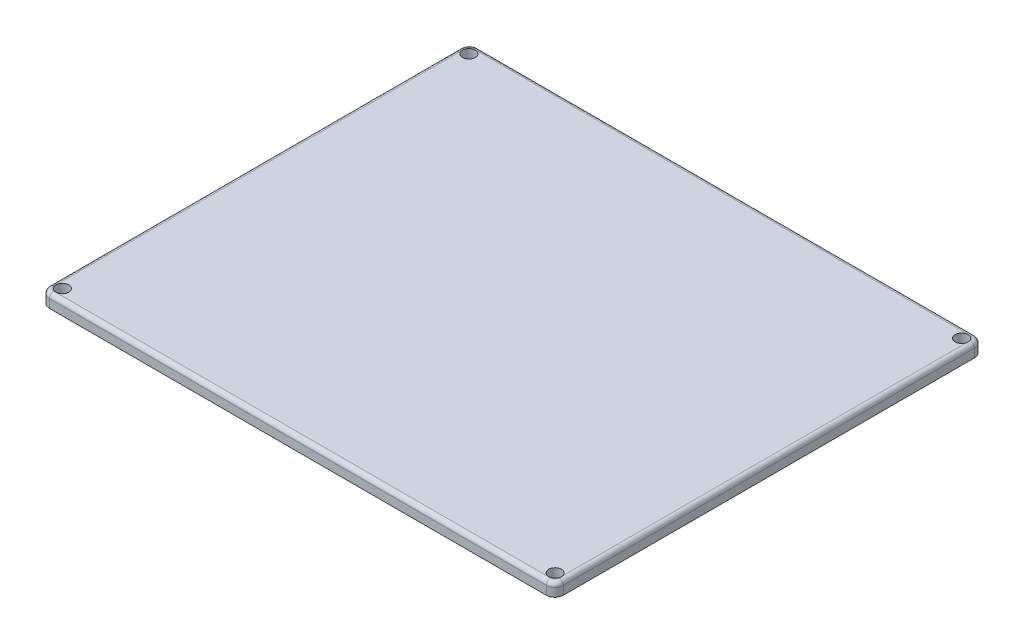
ISO-10303-21;
HEADER;
FILE_DESCRIPTION(('STEP AP214'),'2;1');
FILE_NAME('part.step','',(''),(''),'','','');
FILE_SCHEMA(('AUTOMOTIVE_DESIGN { 1 0 10303 214 1 1 1 1 }'));
ENDSEC;
DATA;
#1=APPLICATION_CONTEXT('core data for automotive mechanical design processes');
#2=APPLICATION_PROTOCOL_DEFINITION('international standard','automotive_design',2000,#1);
#3=PRODUCT_CONTEXT('',#1,'mechanical');
#4=PRODUCT('Part','Part','',(#3));
#5=PRODUCT_RELATED_PRODUCT_CATEGORY('part','',(#4));
#6=PRODUCT_DEFINITION_FORMATION('','',#4);
#7=PRODUCT_DEFINITION_CONTEXT('part definition',#1,'design');
#8=PRODUCT_DEFINITION('design','',#6,#7);
#9=PRODUCT_DEFINITION_SHAPE('','',#8);
#10=(LENGTH_UNIT() NAMED_UNIT(*) SI_UNIT(.MILLI.,.METRE.));
#11=(NAMED_UNIT(*) PLANE_ANGLE_UNIT() SI_UNIT($,.RADIAN.));
#12=(NAMED_UNIT(*) SI_UNIT($,.STERADIAN.) SOLID_ANGLE_UNIT());
#13=UNCERTAINTY_MEASURE_WITH_UNIT(LENGTH_MEASURE(1.E-05),#10,'distance_accuracy_value','');
#14=(GEOMETRIC_REPRESENTATION_CONTEXT(3) GLOBAL_UNCERTAINTY_ASSIGNED_CONTEXT((#13)) GLOBAL_UNIT_ASSIGNED_CONTEXT((#10,
#11,#12)) REPRESENTATION_CONTEXT('',''));
#15=CARTESIAN_POINT('',(0.,0.,0.));
#16=DIRECTION('',(0.,0.,1.));
#17=DIRECTION('',(1.,0.,0.));
#18=AXIS2_PLACEMENT_3D('',#15,#16,#17);
#19=CARTESIAN_POINT('',(0.,3.,0.));
#20=DIRECTION('',(0.,1.,0.));
#21=DIRECTION('',(0.,0.,1.));
#22=AXIS2_PLACEMENT_3D('',#19,#20,#21);
#23=PLANE('',#22);
#24=CARTESIAN_POINT('',(58.,3.,-48.));
#25=DIRECTION('',(0.,1.,0.));
#26=DIRECTION('',(0.,0.,1.));
#27=AXIS2_PLACEMENT_3D('',#24,#25,#26);
#28=CIRCLE('',#27,1.);
#29=CARTESIAN_POINT('',(58.,3.,-49.));
#30=VERTEX_POINT('',#29);
#31=CARTESIAN_POINT('',(59.,3.,-48.));
#32=VERTEX_POINT('',#31);
#33=EDGE_CURVE('E344',#30,#32,#28,.F.);
#34=ORIENTED_EDGE('',*,*,#33,.F.);
#35=DIRECTION('',(-1.,0.,0.));
#36=VECTOR('',#35,1.);
#37=CARTESIAN_POINT('',(-60.,3.,-49.));
#38=LINE('',#37,#36);
#39=CARTESIAN_POINT('',(-58.,3.,-49.));
#40=VERTEX_POINT('',#39);
#41=EDGE_CURVE('E411',#30,#40,#38,.T.);
#42=ORIENTED_EDGE('',*,*,#41,.T.);
#43=CARTESIAN_POINT('',(-58.,3.,-48.));
#44=DIRECTION('',(0.,1.,0.));
#45=DIRECTION('',(0.,0.,1.));
#46=AXIS2_PLACEMENT_3D('',#43,#44,#45);
#47=CIRCLE('',#46,1.);
#48=CARTESIAN_POINT('',(-59.,3.,-48.));
#49=VERTEX_POINT('',#48);
#50=EDGE_CURVE('E332',#49,#40,#47,.F.);
#51=ORIENTED_EDGE('',*,*,#50,.F.);
#52=DIRECTION('',(0.,0.,1.));
#53=VECTOR('',#52,1.);
#54=CARTESIAN_POINT('',(-59.,3.,50.));
#55=LINE('',#54,#53);
#56=CARTESIAN_POINT('',(-59.,3.,-47.7587144016012));
#57=VERTEX_POINT('',#56);
#58=EDGE_CURVE('E183',#49,#57,#55,.T.);
#59=ORIENTED_EDGE('',*,*,#58,.T.);
#60=CARTESIAN_POINT('',(-57.5290232809627,3.,-47.4650692210682));
#61=DIRECTION('',(0.,-1.,0.));
#62=DIRECTION('',(0.,0.,1.));
#63=AXIS2_PLACEMENT_3D('',#60,#61,#62);
#64=CIRCLE('',#63,1.5);
#65=CARTESIAN_POINT('',(-59.,3.,-47.1714240405352));
#66=VERTEX_POINT('',#65);
#67=EDGE_CURVE('E456',#57,#66,#64,.T.);
#68=ORIENTED_EDGE('',*,*,#67,.T.);
#69=DIRECTION('',(0.,0.,1.));
#70=VECTOR('',#69,1.);
#71=CARTESIAN_POINT('',(-59.,3.,50.));
#72=LINE('',#71,#70);
#73=CARTESIAN_POINT('',(-59.,3.,47.1714240405351));
#74=VERTEX_POINT('',#73);
#75=EDGE_CURVE('E200',#66,#74,#72,.T.);
#76=ORIENTED_EDGE('',*,*,#75,.T.);
#77=CARTESIAN_POINT('',(-57.5290232809627,3.,47.4650692210682));
#78=DIRECTION('',(0.,-1.,0.));
#79=DIRECTION('',(0.,0.,-1.));
#80=AXIS2_PLACEMENT_3D('',#77,#78,#79);
#81=CIRCLE('',#80,1.5);
#82=CARTESIAN_POINT('',(-59.,3.,47.7587144016013));
#83=VERTEX_POINT('',#82);
#84=EDGE_CURVE('E447',#74,#83,#81,.T.);
#85=ORIENTED_EDGE('',*,*,#84,.T.);
#86=DIRECTION('',(0.,0.,1.));
#87=VECTOR('',#86,1.);
#88=CARTESIAN_POINT('',(-59.,3.,50.));
#89=LINE('',#88,#87);
#90=CARTESIAN_POINT('',(-59.,3.,48.));
#91=VERTEX_POINT('',#90);
#92=EDGE_CURVE('E196',#83,#91,#89,.T.);
#93=ORIENTED_EDGE('',*,*,#92,.T.);
#94=CARTESIAN_POINT('',(-58.,3.,48.));
#95=DIRECTION('',(0.,1.,0.));
#96=DIRECTION('',(0.,0.,1.));
#97=AXIS2_PLACEMENT_3D('',#94,#95,#96);
#98=CIRCLE('',#97,1.);
#99=CARTESIAN_POINT('',(-58.,3.,49.));
#100=VERTEX_POINT('',#99);
#101=EDGE_CURVE('E426',#100,#91,#98,.F.);
#102=ORIENTED_EDGE('',*,*,#101,.F.);
#103=DIRECTION('',(1.,0.,0.));
#104=VECTOR('',#103,1.);
#105=CARTESIAN_POINT('',(60.,3.,49.));
#106=LINE('',#105,#104);
#107=CARTESIAN_POINT('',(58.,3.,49.));
#108=VERTEX_POINT('',#107);
#109=EDGE_CURVE('E187',#100,#108,#106,.T.);
#110=ORIENTED_EDGE('',*,*,#109,.T.);
#111=CARTESIAN_POINT('',(58.,3.,48.));
#112=DIRECTION('',(0.,1.,0.));
#113=DIRECTION('',(0.,0.,1.));
#114=AXIS2_PLACEMENT_3D('',#111,#112,#113);
#115=CIRCLE('',#114,1.);
#116=CARTESIAN_POINT('',(59.,3.,48.));
#117=VERTEX_POINT('',#116);
#118=EDGE_CURVE('E431',#117,#108,#115,.F.);
#119=ORIENTED_EDGE('',*,*,#118,.F.);
#120=DIRECTION('',(0.,0.,-1.));
#121=VECTOR('',#120,1.);
#122=CARTESIAN_POINT('',(59.,3.,-50.));
#123=LINE('',#122,#121);
#124=CARTESIAN_POINT('',(59.,3.,47.7587144016013));
#125=VERTEX_POINT('',#124);
#126=EDGE_CURVE('E173',#117,#125,#123,.T.);
#127=ORIENTED_EDGE('',*,*,#126,.T.);
#128=CARTESIAN_POINT('',(57.5290232809627,3.,47.4650692210682));
#129=DIRECTION('',(0.,-1.,0.));
#130=DIRECTION('',(0.,0.,1.));
#131=AXIS2_PLACEMENT_3D('',#128,#129,#130);
#132=CIRCLE('',#131,1.5);
#133=CARTESIAN_POINT('',(59.,3.,47.171424040535));
#134=VERTEX_POINT('',#133);
#135=EDGE_CURVE('E160',#125,#134,#132,.T.);
#136=ORIENTED_EDGE('',*,*,#135,.T.);
#137=DIRECTION('',(0.,0.,-1.));
#138=VECTOR('',#137,1.);
#139=CARTESIAN_POINT('',(59.,3.,-50.));
#140=LINE('',#139,#138);
#141=CARTESIAN_POINT('',(59.,3.,-47.1714240405352));
#142=VERTEX_POINT('',#141);
#143=EDGE_CURVE('E170',#134,#142,#140,.T.);
#144=ORIENTED_EDGE('',*,*,#143,.T.);
#145=CARTESIAN_POINT('',(57.5290232809627,3.,-47.4650692210682));
#146=DIRECTION('',(0.,-1.,0.));
#147=DIRECTION('',(0.,0.,-1.));
#148=AXIS2_PLACEMENT_3D('',#145,#146,#147);
#149=CIRCLE('',#148,1.5);
#150=CARTESIAN_POINT('',(59.,3.,-47.7587144016013));
#151=VERTEX_POINT('',#150);
#152=EDGE_CURVE('E419',#142,#151,#149,.T.);
#153=ORIENTED_EDGE('',*,*,#152,.T.);
#154=DIRECTION('',(0.,0.,-1.));
#155=VECTOR('',#154,1.);
#156=CARTESIAN_POINT('',(59.,3.,-50.));
#157=LINE('',#156,#155);
#158=EDGE_CURVE('E189',#151,#32,#157,.T.);
#159=ORIENTED_EDGE('',*,*,#158,.T.);
#160=EDGE_LOOP('',(#34,#42,#51,#59,#68,#76,#85,#93,#102,#110,#119,#127,#136,#144,#153,#159));
#161=FACE_BOUND('',#160,.T.);
#162=ADVANCED_FACE('F40',(#161),#23,.T.);
#163=CARTESIAN_POINT('',(60.,3.,-50.));
#164=DIRECTION('',(-1.,0.,0.));
#165=DIRECTION('',(0.,0.,1.));
#166=AXIS2_PLACEMENT_3D('',#163,#164,#165);
#167=PLANE('',#166);
#168=DIRECTION('',(0.,0.,-1.));
#169=VECTOR('',#168,1.);
#170=CARTESIAN_POINT('',(60.,2.,50.));
#171=LINE('',#170,#169);
#172=CARTESIAN_POINT('',(60.,2.,-48.));
#173=VERTEX_POINT('',#172);
#174=CARTESIAN_POINT('',(60.,2.,48.));
#175=VERTEX_POINT('',#174);
#176=EDGE_CURVE('E243',#173,#175,#171,.F.);
#177=ORIENTED_EDGE('',*,*,#176,.T.);
#178=DIRECTION('',(0.,-1.,0.));
#179=VECTOR('',#178,1.);
#180=CARTESIAN_POINT('',(60.,3.,48.));
#181=LINE('',#180,#179);
#182=CARTESIAN_POINT('',(60.,0.,48.));
#183=VERTEX_POINT('',#182);
#184=EDGE_CURVE('E381',#175,#183,#181,.T.);
#185=ORIENTED_EDGE('',*,*,#184,.T.);
#186=DIRECTION('',(0.,0.,-1.));
#187=VECTOR('',#186,1.);
#188=CARTESIAN_POINT('',(60.,0.,-50.));
#189=LINE('',#188,#187);
#190=CARTESIAN_POINT('',(60.,0.,-48.));
#191=VERTEX_POINT('',#190);
#192=EDGE_CURVE('E317',#183,#191,#189,.T.);
#193=ORIENTED_EDGE('',*,*,#192,.T.);
#194=DIRECTION('',(0.,-1.,0.));
#195=VECTOR('',#194,1.);
#196=CARTESIAN_POINT('',(60.,3.,-48.));
#197=LINE('',#196,#195);
#198=EDGE_CURVE('E378',#191,#173,#197,.F.);
#199=ORIENTED_EDGE('',*,*,#198,.T.);
#200=EDGE_LOOP('',(#177,#185,#193,#199));
#201=FACE_BOUND('',#200,.T.);
#202=ADVANCED_FACE('F287',(#201),#167,.F.);
#203=CARTESIAN_POINT('',(-60.,3.,-50.));
#204=DIRECTION('',(0.,0.,1.));
#205=DIRECTION('',(1.,0.,0.));
#206=AXIS2_PLACEMENT_3D('',#203,#204,#205);
#207=PLANE('',#206);
#208=DIRECTION('',(-1.,0.,0.));
#209=VECTOR('',#208,1.);
#210=CARTESIAN_POINT('',(-60.,0.,-50.));
#211=LINE('',#210,#209);
#212=CARTESIAN_POINT('',(58.,0.,-50.));
#213=VERTEX_POINT('',#212);
#214=CARTESIAN_POINT('',(-58.,0.,-50.));
#215=VERTEX_POINT('',#214);
#216=EDGE_CURVE('E311',#213,#215,#211,.T.);
#217=ORIENTED_EDGE('',*,*,#216,.T.);
#218=DIRECTION('',(0.,-1.,0.));
#219=VECTOR('',#218,1.);
#220=CARTESIAN_POINT('',(-58.,3.,-50.));
#221=LINE('',#220,#219);
#222=CARTESIAN_POINT('',(-58.,2.,-50.));
#223=VERTEX_POINT('',#222);
#224=EDGE_CURVE('E11',#215,#223,#221,.F.);
#225=ORIENTED_EDGE('',*,*,#224,.T.);
#226=DIRECTION('',(-1.,0.,0.));
#227=VECTOR('',#226,1.);
#228=CARTESIAN_POINT('',(60.,2.,-50.));
#229=LINE('',#228,#227);
#230=CARTESIAN_POINT('',(58.,2.,-50.));
#231=VERTEX_POINT('',#230);
#232=EDGE_CURVE('E433',#223,#231,#229,.F.);
#233=ORIENTED_EDGE('',*,*,#232,.T.);
#234=DIRECTION('',(0.,-1.,0.));
#235=VECTOR('',#234,1.);
#236=CARTESIAN_POINT('',(58.,3.,-50.));
#237=LINE('',#236,#235);
#238=EDGE_CURVE('E50',#231,#213,#237,.T.);
#239=ORIENTED_EDGE('',*,*,#238,.T.);
#240=EDGE_LOOP('',(#217,#225,#233,#239));
#241=FACE_BOUND('',#240,.T.);
#242=ADVANCED_FACE('F292',(#241),#207,.F.);
#243=CARTESIAN_POINT('',(-60.,3.,-50.));
#244=DIRECTION('',(1.,0.,0.));
#245=DIRECTION('',(0.,0.,-1.));
#246=AXIS2_PLACEMENT_3D('',#243,#244,#245);
#247=PLANE('',#246);
#248=DIRECTION('',(0.,0.,1.));
#249=VECTOR('',#248,1.);
#250=CARTESIAN_POINT('',(-60.,0.,-50.));
#251=LINE('',#250,#249);
#252=CARTESIAN_POINT('',(-60.,0.,-48.));
#253=VERTEX_POINT('',#252);
#254=CARTESIAN_POINT('',(-60.,0.,48.));
#255=VERTEX_POINT('',#254);
#256=EDGE_CURVE('E316',#253,#255,#251,.T.);
#257=ORIENTED_EDGE('',*,*,#256,.T.);
#258=DIRECTION('',(0.,-1.,0.));
#259=VECTOR('',#258,1.);
#260=CARTESIAN_POINT('',(-60.,3.,48.));
#261=LINE('',#260,#259);
#262=CARTESIAN_POINT('',(-60.,2.,48.));
#263=VERTEX_POINT('',#262);
#264=EDGE_CURVE('E375',#255,#263,#261,.F.);
#265=ORIENTED_EDGE('',*,*,#264,.T.);
#266=DIRECTION('',(0.,0.,1.));
#267=VECTOR('',#266,1.);
#268=CARTESIAN_POINT('',(-60.,2.,-50.));
#269=LINE('',#268,#267);
#270=CARTESIAN_POINT('',(-60.,2.,-48.));
#271=VERTEX_POINT('',#270);
#272=EDGE_CURVE('E483',#263,#271,#269,.F.);
#273=ORIENTED_EDGE('',*,*,#272,.T.);
#274=DIRECTION('',(0.,-1.,0.));
#275=VECTOR('',#274,1.);
#276=CARTESIAN_POINT('',(-60.,3.,-48.));
#277=LINE('',#276,#275);
#278=EDGE_CURVE('E324',#271,#253,#277,.T.);
#279=ORIENTED_EDGE('',*,*,#278,.T.);
#280=EDGE_LOOP('',(#257,#265,#273,#279));
#281=FACE_BOUND('',#280,.T.);
#282=ADVANCED_FACE('F303',(#281),#247,.F.);
#283=CARTESIAN_POINT('',(-60.,3.,50.));
#284=DIRECTION('',(0.,0.,-1.));
#285=DIRECTION('',(-1.,0.,0.));
#286=AXIS2_PLACEMENT_3D('',#283,#284,#285);
#287=PLANE('',#286);
#288=DIRECTION('',(1.,0.,0.));
#289=VECTOR('',#288,1.);
#290=CARTESIAN_POINT('',(-60.,2.,50.));
#291=LINE('',#290,#289);
#292=CARTESIAN_POINT('',(58.,2.,50.));
#293=VERTEX_POINT('',#292);
#294=CARTESIAN_POINT('',(-58.,2.,50.));
#295=VERTEX_POINT('',#294);
#296=EDGE_CURVE('E166',#293,#295,#291,.F.);
#297=ORIENTED_EDGE('',*,*,#296,.T.);
#298=DIRECTION('',(0.,-1.,0.));
#299=VECTOR('',#298,1.);
#300=CARTESIAN_POINT('',(-58.,3.,50.));
#301=LINE('',#300,#299);
#302=CARTESIAN_POINT('',(-58.,0.,50.));
#303=VERTEX_POINT('',#302);
#304=EDGE_CURVE('E359',#295,#303,#301,.T.);
#305=ORIENTED_EDGE('',*,*,#304,.T.);
#306=DIRECTION('',(1.,0.,0.));
#307=VECTOR('',#306,1.);
#308=CARTESIAN_POINT('',(-60.,0.,50.));
#309=LINE('',#308,#307);
#310=CARTESIAN_POINT('',(58.,0.,50.));
#311=VERTEX_POINT('',#310);
#312=EDGE_CURVE('E404',#303,#311,#309,.T.);
#313=ORIENTED_EDGE('',*,*,#312,.T.);
#314=DIRECTION('',(0.,-1.,0.));
#315=VECTOR('',#314,1.);
#316=CARTESIAN_POINT('',(58.,3.,50.));
#317=LINE('',#316,#315);
#318=EDGE_CURVE('E356',#311,#293,#317,.F.);
#319=ORIENTED_EDGE('',*,*,#318,.T.);
#320=EDGE_LOOP('',(#297,#305,#313,#319));
#321=FACE_BOUND('',#320,.T.);
#322=ADVANCED_FACE('F299',(#321),#287,.F.);
#323=CARTESIAN_POINT('',(0.,0.,0.));
#324=DIRECTION('',(0.,1.,0.));
#325=DIRECTION('',(0.,0.,1.));
#326=AXIS2_PLACEMENT_3D('',#323,#324,#325);
#327=PLANE('',#326);
#328=CARTESIAN_POINT('',(57.5290232809627,0.,47.4650692210682));
#329=DIRECTION('',(0.,-1.,0.));
#330=DIRECTION('',(0.,0.,1.));
#331=AXIS2_PLACEMENT_3D('',#328,#329,#330);
#332=CIRCLE('',#331,1.5);
#333=CARTESIAN_POINT('',(57.5290232809627,0.,48.9650692210682));
#334=VERTEX_POINT('',#333);
#335=EDGE_CURVE('E176',#334,#334,#332,.T.);
#336=ORIENTED_EDGE('',*,*,#335,.F.);
#337=EDGE_LOOP('',(#336));
#338=FACE_BOUND('',#337,.T.);
#339=CARTESIAN_POINT('',(57.5290232809627,0.,-47.4650692210682));
#340=DIRECTION('',(0.,-1.,0.));
#341=DIRECTION('',(0.,0.,-1.));
#342=AXIS2_PLACEMENT_3D('',#339,#340,#341);
#343=CIRCLE('',#342,1.5);
#344=CARTESIAN_POINT('',(57.5290232809627,0.,-48.9650692210682));
#345=VERTEX_POINT('',#344);
#346=EDGE_CURVE('E175',#345,#345,#343,.T.);
#347=ORIENTED_EDGE('',*,*,#346,.F.);
#348=EDGE_LOOP('',(#347));
#349=FACE_BOUND('',#348,.T.);
#350=CARTESIAN_POINT('',(-57.5290232809627,0.,-47.4650692210682));
#351=DIRECTION('',(0.,-1.,0.));
#352=DIRECTION('',(0.,0.,1.));
#353=AXIS2_PLACEMENT_3D('',#350,#351,#352);
#354=CIRCLE('',#353,1.5);
#355=CARTESIAN_POINT('',(-57.5290232809627,0.,-45.9650692210682));
#356=VERTEX_POINT('',#355);
#357=EDGE_CURVE('E466',#356,#356,#354,.T.);
#358=ORIENTED_EDGE('',*,*,#357,.F.);
#359=EDGE_LOOP('',(#358));
#360=FACE_BOUND('',#359,.T.);
#361=CARTESIAN_POINT('',(-57.5290232809627,0.,47.4650692210682));
#362=DIRECTION('',(0.,-1.,0.));
#363=DIRECTION('',(0.,0.,-1.));
#364=AXIS2_PLACEMENT_3D('',#361,#362,#363);
#365=CIRCLE('',#364,1.5);
#366=CARTESIAN_POINT('',(-57.5290232809627,0.,45.9650692210682));
#367=VERTEX_POINT('',#366);
#368=EDGE_CURVE('E451',#367,#367,#365,.T.);
#369=ORIENTED_EDGE('',*,*,#368,.F.);
#370=EDGE_LOOP('',(#369));
#371=FACE_BOUND('',#370,.T.);
#372=ORIENTED_EDGE('',*,*,#312,.F.);
#373=CARTESIAN_POINT('',(-58.,0.,48.));
#374=DIRECTION('',(0.,1.,0.));
#375=DIRECTION('',(0.,0.,1.));
#376=AXIS2_PLACEMENT_3D('',#373,#374,#375);
#377=CIRCLE('',#376,2.);
#378=EDGE_CURVE('E370',#303,#255,#377,.F.);
#379=ORIENTED_EDGE('',*,*,#378,.T.);
#380=ORIENTED_EDGE('',*,*,#256,.F.);
#381=CARTESIAN_POINT('',(-58.,0.,-48.));
#382=DIRECTION('',(0.,1.,0.));
#383=DIRECTION('',(0.,0.,1.));
#384=AXIS2_PLACEMENT_3D('',#381,#382,#383);
#385=CIRCLE('',#384,2.);
#386=EDGE_CURVE('E58',#253,#215,#385,.F.);
#387=ORIENTED_EDGE('',*,*,#386,.T.);
#388=ORIENTED_EDGE('',*,*,#216,.F.);
#389=CARTESIAN_POINT('',(58.,0.,-48.));
#390=DIRECTION('',(0.,1.,0.));
#391=DIRECTION('',(0.,0.,1.));
#392=AXIS2_PLACEMENT_3D('',#389,#390,#391);
#393=CIRCLE('',#392,2.);
#394=EDGE_CURVE('E362',#213,#191,#393,.F.);
#395=ORIENTED_EDGE('',*,*,#394,.T.);
#396=ORIENTED_EDGE('',*,*,#192,.F.);
#397=CARTESIAN_POINT('',(58.,0.,48.));
#398=DIRECTION('',(0.,1.,0.));
#399=DIRECTION('',(0.,0.,1.));
#400=AXIS2_PLACEMENT_3D('',#397,#398,#399);
#401=CIRCLE('',#400,2.);
#402=EDGE_CURVE('E367',#183,#311,#401,.F.);
#403=ORIENTED_EDGE('',*,*,#402,.T.);
#404=EDGE_LOOP('',(#372,#379,#380,#387,#388,#395,#396,#403));
#405=FACE_BOUND('',#404,.T.);
#406=ADVANCED_FACE('F296',(#338,#349,#360,#371,#405),#327,.F.);
#407=CARTESIAN_POINT('',(-57.5290232809627,3.,47.4650692210682));
#408=DIRECTION('',(0.,-1.,0.));
#409=DIRECTION('',(0.,0.,-1.));
#410=AXIS2_PLACEMENT_3D('',#407,#408,#409);
#411=CYLINDRICAL_SURFACE('',#410,1.5);
#412=ORIENTED_EDGE('',*,*,#84,.F.);
#413=CARTESIAN_POINT('',(-59.,3.,47.1714240405351));
#414=CARTESIAN_POINT('',(-59.0083872113738,2.99997878941921,47.2134126434519));
#415=CARTESIAN_POINT('',(-59.0149668784491,2.99989359339045,47.2557625439908));
#416=CARTESIAN_POINT('',(-59.024487361555,2.99971721313131,47.3408968846018));
#417=CARTESIAN_POINT('',(-59.0274258538831,2.99962602511604,47.3836815846133));
#418=CARTESIAN_POINT('',(-59.0296113932967,2.99956052348855,47.4686409536163));
#419=CARTESIAN_POINT('',(-59.0289181663716,2.99958431840254,47.5108141249002));
#420=CARTESIAN_POINT('',(-59.0239845419027,2.99971588494703,47.5949280338002));
#421=CARTESIAN_POINT('',(-59.0197468159685,2.9998235933249,47.6368689225358));
#422=CARTESIAN_POINT('',(-59.0118280685509,2.99993170257502,47.6919471974118));
#423=CARTESIAN_POINT('',(-59.0097195429717,2.99995533172311,47.7053233795235));
#424=CARTESIAN_POINT('',(-59.0051349657426,2.99998950356134,47.7320494919815));
#425=CARTESIAN_POINT('',(-59.0026579453204,3.00000001104911,47.7453992561897));
#426=CARTESIAN_POINT('',(-59.,3.,47.7587144016013));
#427=B_SPLINE_CURVE_WITH_KNOTS('',3,(#413,#414,#415,#416,#417,#418,#419,#420,#421,#422,#423,
#424,#425,#426),.UNSPECIFIED.,.F.,.F.,(4,2,2,2,2,2,4),(0.,0.128416287547988,0.256914484874621,
0.383306147278331,0.509602629741251,0.550223222388362,0.590952558134773),.UNSPECIFIED.);
#428=EDGE_CURVE('E212',#74,#83,#427,.T.);
#429=ORIENTED_EDGE('',*,*,#428,.T.);
#430=EDGE_LOOP('',(#412,#429));
#431=FACE_BOUND('',#430,.T.);
#432=ORIENTED_EDGE('',*,*,#368,.T.);
#433=EDGE_LOOP('',(#432));
#434=FACE_BOUND('',#433,.T.);
#435=ADVANCED_FACE('F228',(#431,#434),#411,.F.);
#436=CARTESIAN_POINT('',(-57.5290232809627,3.,-47.4650692210682));
#437=DIRECTION('',(0.,-1.,0.));
#438=DIRECTION('',(0.,0.,-1.));
#439=AXIS2_PLACEMENT_3D('',#436,#437,#438);
#440=CYLINDRICAL_SURFACE('',#439,1.5);
#441=ORIENTED_EDGE('',*,*,#67,.F.);
#442=CARTESIAN_POINT('',(-59.,3.,-47.7587144016012));
#443=CARTESIAN_POINT('',(-59.0083872113738,2.99997878941921,-47.7167257986844));
#444=CARTESIAN_POINT('',(-59.0149668784491,2.99989359339045,-47.6743758981455));
#445=CARTESIAN_POINT('',(-59.024487361555,2.99971721313131,-47.5892415575345));
#446=CARTESIAN_POINT('',(-59.0274258538831,2.99962602511604,-47.546456857523));
#447=CARTESIAN_POINT('',(-59.0296113932967,2.99956052348855,-47.46149748852));
#448=CARTESIAN_POINT('',(-59.0289181663716,2.99958431840254,-47.4193243172362));
#449=CARTESIAN_POINT('',(-59.0239845419027,2.99971588494703,-47.3352104083361));
#450=CARTESIAN_POINT('',(-59.0197468159685,2.9998235933249,-47.2932695196005));
#451=CARTESIAN_POINT('',(-59.0118280685509,2.99993170257502,-47.2381912447245));
#452=CARTESIAN_POINT('',(-59.0097195429717,2.99995533172311,-47.2248150626129));
#453=CARTESIAN_POINT('',(-59.0051349657427,2.99998950356134,-47.1980889501549));
#454=CARTESIAN_POINT('',(-59.0026579453204,3.00000001104911,-47.1847391859468));
#455=CARTESIAN_POINT('',(-59.,3.,-47.1714240405352));
#456=B_SPLINE_CURVE_WITH_KNOTS('',3,(#442,#443,#444,#445,#446,#447,#448,#449,#450,#451,#452,
#453,#454,#455),.UNSPECIFIED.,.F.,.F.,(4,2,2,2,2,2,4),(0.,0.128416287547986,0.256914484874619,
0.383306147278323,0.509602629741251,0.550223222388256,0.590952558134561),.UNSPECIFIED.);
#457=EDGE_CURVE('E203',#57,#66,#456,.T.);
#458=ORIENTED_EDGE('',*,*,#457,.T.);
#459=EDGE_LOOP('',(#441,#458));
#460=FACE_BOUND('',#459,.T.);
#461=ORIENTED_EDGE('',*,*,#357,.T.);
#462=EDGE_LOOP('',(#461));
#463=FACE_BOUND('',#462,.T.);
#464=ADVANCED_FACE('F223',(#460,#463),#440,.F.);
#465=CARTESIAN_POINT('',(57.5290232809627,3.,-47.4650692210682));
#466=DIRECTION('',(0.,-1.,0.));
#467=DIRECTION('',(0.,0.,-1.));
#468=AXIS2_PLACEMENT_3D('',#465,#466,#467);
#469=CYLINDRICAL_SURFACE('',#468,1.5);
#470=ORIENTED_EDGE('',*,*,#152,.F.);
#471=CARTESIAN_POINT('',(59.,3.,-47.1714240405352));
#472=CARTESIAN_POINT('',(59.0083872113738,2.99997878941921,-47.213412643452));
#473=CARTESIAN_POINT('',(59.0149668784491,2.99989359339045,-47.2557625439909));
#474=CARTESIAN_POINT('',(59.024487361555,2.99971721313131,-47.3408968846019));
#475=CARTESIAN_POINT('',(59.0274258538831,2.99962602511604,-47.3836815846134));
#476=CARTESIAN_POINT('',(59.0296113932967,2.99956052348855,-47.4686409536164));
#477=CARTESIAN_POINT('',(59.0289181663715,2.99958431840254,-47.5108141249003));
#478=CARTESIAN_POINT('',(59.0239845419026,2.99971588494703,-47.5949280338003));
#479=CARTESIAN_POINT('',(59.0197468159685,2.9998235933249,-47.6368689225359));
#480=CARTESIAN_POINT('',(59.0118280685509,2.99993170257502,-47.6919471974119));
#481=CARTESIAN_POINT('',(59.0097195429717,2.99995533172311,-47.7053233795235));
#482=CARTESIAN_POINT('',(59.0051349657426,2.99998950356134,-47.7320494919816));
#483=CARTESIAN_POINT('',(59.0026579453203,3.00000001104911,-47.7453992561897));
#484=CARTESIAN_POINT('',(59.,3.,-47.7587144016013));
#485=B_SPLINE_CURVE_WITH_KNOTS('',3,(#471,#472,#473,#474,#475,#476,#477,#478,#479,#480,#481,
#482,#483,#484),.UNSPECIFIED.,.F.,.F.,(4,2,2,2,2,2,4),(0.,0.128416287547988,0.25691448487462,
0.383306147278337,0.509602629741259,0.550223222388292,0.590952558134633),.UNSPECIFIED.);
#486=EDGE_CURVE('E165',#142,#151,#485,.T.);
#487=ORIENTED_EDGE('',*,*,#486,.T.);
#488=EDGE_LOOP('',(#470,#487));
#489=FACE_BOUND('',#488,.T.);
#490=ORIENTED_EDGE('',*,*,#346,.T.);
#491=EDGE_LOOP('',(#490));
#492=FACE_BOUND('',#491,.T.);
#493=ADVANCED_FACE('F227',(#489,#492),#469,.F.);
#494=CARTESIAN_POINT('',(57.5290232809627,3.,47.4650692210682));
#495=DIRECTION('',(0.,-1.,0.));
#496=DIRECTION('',(0.,0.,-1.));
#497=AXIS2_PLACEMENT_3D('',#494,#495,#496);
#498=CYLINDRICAL_SURFACE('',#497,1.5);
#499=ORIENTED_EDGE('',*,*,#135,.F.);
#500=CARTESIAN_POINT('',(59.,3.,47.7587144016013));
#501=CARTESIAN_POINT('',(59.0083872113738,2.99997878941921,47.7167257986845));
#502=CARTESIAN_POINT('',(59.0149668784491,2.99989359339045,47.6743758981456));
#503=CARTESIAN_POINT('',(59.024487361555,2.99971721313131,47.5892415575346));
#504=CARTESIAN_POINT('',(59.0274258538831,2.99962602511604,47.5464568575232));
#505=CARTESIAN_POINT('',(59.0296113932967,2.99956052348855,47.4614974885201));
#506=CARTESIAN_POINT('',(59.0289181663716,2.99958431840254,47.4193243172363));
#507=CARTESIAN_POINT('',(59.0239845419027,2.99971588494703,47.3352104083362));
#508=CARTESIAN_POINT('',(59.0197468159685,2.9998235933249,47.2932695196006));
#509=CARTESIAN_POINT('',(59.0118280685509,2.99993170257501,47.2381912447246));
#510=CARTESIAN_POINT('',(59.0097195429717,2.99995533172311,47.2248150626129));
#511=CARTESIAN_POINT('',(59.0051349657426,2.99998950356134,47.1980889501548));
#512=CARTESIAN_POINT('',(59.0026579453204,3.00000001104911,47.1847391859467));
#513=CARTESIAN_POINT('',(59.,3.,47.171424040535));
#514=B_SPLINE_CURVE_WITH_KNOTS('',3,(#500,#501,#502,#503,#504,#505,#506,#507,#508,#509,#510,
#511,#512,#513),.UNSPECIFIED.,.F.,.F.,(4,2,2,2,2,2,4),(0.,0.128416287547982,0.256914484874615,
0.383306147278325,0.50960262974126,0.550223222388391,0.590952558134844),.UNSPECIFIED.);
#515=EDGE_CURVE('E156',#125,#134,#514,.T.);
#516=ORIENTED_EDGE('',*,*,#515,.T.);
#517=EDGE_LOOP('',(#499,#516));
#518=FACE_BOUND('',#517,.T.);
#519=ORIENTED_EDGE('',*,*,#335,.T.);
#520=EDGE_LOOP('',(#519));
#521=FACE_BOUND('',#520,.T.);
#522=ADVANCED_FACE('F158',(#518,#521),#498,.F.);
#523=CARTESIAN_POINT('',(59.,2.,0.));
#524=DIRECTION('',(0.,0.,1.));
#525=DIRECTION('',(1.,0.,0.));
#526=AXIS2_PLACEMENT_3D('',#523,#524,#525);
#527=CYLINDRICAL_SURFACE('',#526,1.);
#528=ORIENTED_EDGE('',*,*,#176,.F.);
#529=CARTESIAN_POINT('',(59.,2.,-48.));
#530=DIRECTION('',(0.,0.,1.));
#531=DIRECTION('',(1.,0.,0.));
#532=AXIS2_PLACEMENT_3D('',#529,#530,#531);
#533=CIRCLE('',#532,1.);
#534=EDGE_CURVE('E422',#173,#32,#533,.T.);
#535=ORIENTED_EDGE('',*,*,#534,.T.);
#536=ORIENTED_EDGE('',*,*,#158,.F.);
#537=ORIENTED_EDGE('',*,*,#486,.F.);
#538=ORIENTED_EDGE('',*,*,#143,.F.);
#539=ORIENTED_EDGE('',*,*,#515,.F.);
#540=ORIENTED_EDGE('',*,*,#126,.F.);
#541=CARTESIAN_POINT('',(59.,2.,48.));
#542=DIRECTION('',(0.,0.,-1.));
#543=DIRECTION('',(-1.,0.,0.));
#544=AXIS2_PLACEMENT_3D('',#541,#542,#543);
#545=CIRCLE('',#544,1.);
#546=EDGE_CURVE('E427',#117,#175,#545,.T.);
#547=ORIENTED_EDGE('',*,*,#546,.T.);
#548=EDGE_LOOP('',(#528,#535,#536,#537,#538,#539,#540,#547));
#549=FACE_BOUND('',#548,.T.);
#550=ADVANCED_FACE('F180',(#549),#527,.T.);
#551=CARTESIAN_POINT('',(0.,2.,-49.));
#552=DIRECTION('',(1.,0.,0.));
#553=DIRECTION('',(0.,0.,-1.));
#554=AXIS2_PLACEMENT_3D('',#551,#552,#553);
#555=CYLINDRICAL_SURFACE('',#554,1.);
#556=ORIENTED_EDGE('',*,*,#232,.F.);
#557=CARTESIAN_POINT('',(-58.,2.,-49.));
#558=DIRECTION('',(1.,0.,0.));
#559=DIRECTION('',(0.,0.,-1.));
#560=AXIS2_PLACEMENT_3D('',#557,#558,#559);
#561=CIRCLE('',#560,1.);
#562=EDGE_CURVE('E331',#223,#40,#561,.T.);
#563=ORIENTED_EDGE('',*,*,#562,.T.);
#564=ORIENTED_EDGE('',*,*,#41,.F.);
#565=CARTESIAN_POINT('',(58.,2.,-49.));
#566=DIRECTION('',(-1.,0.,0.));
#567=DIRECTION('',(0.,0.,1.));
#568=AXIS2_PLACEMENT_3D('',#565,#566,#567);
#569=CIRCLE('',#568,1.);
#570=EDGE_CURVE('E338',#30,#231,#569,.T.);
#571=ORIENTED_EDGE('',*,*,#570,.T.);
#572=EDGE_LOOP('',(#556,#563,#564,#571));
#573=FACE_BOUND('',#572,.T.);
#574=ADVANCED_FACE('F254',(#573),#555,.T.);
#575=CARTESIAN_POINT('',(0.,2.,49.));
#576=DIRECTION('',(-1.,0.,0.));
#577=DIRECTION('',(0.,0.,1.));
#578=AXIS2_PLACEMENT_3D('',#575,#576,#577);
#579=CYLINDRICAL_SURFACE('',#578,1.);
#580=ORIENTED_EDGE('',*,*,#296,.F.);
#581=CARTESIAN_POINT('',(58.,2.,49.));
#582=DIRECTION('',(-1.,0.,0.));
#583=DIRECTION('',(0.,0.,1.));
#584=AXIS2_PLACEMENT_3D('',#581,#582,#583);
#585=CIRCLE('',#584,1.);
#586=EDGE_CURVE('E342',#293,#108,#585,.T.);
#587=ORIENTED_EDGE('',*,*,#586,.T.);
#588=ORIENTED_EDGE('',*,*,#109,.F.);
#589=CARTESIAN_POINT('',(-58.,2.,49.));
#590=DIRECTION('',(1.,0.,0.));
#591=DIRECTION('',(0.,0.,-1.));
#592=AXIS2_PLACEMENT_3D('',#589,#590,#591);
#593=CIRCLE('',#592,1.);
#594=EDGE_CURVE('E337',#100,#295,#593,.T.);
#595=ORIENTED_EDGE('',*,*,#594,.T.);
#596=EDGE_LOOP('',(#580,#587,#588,#595));
#597=FACE_BOUND('',#596,.T.);
#598=ADVANCED_FACE('F489',(#597),#579,.T.);
#599=CARTESIAN_POINT('',(-59.,2.,0.));
#600=DIRECTION('',(0.,0.,-1.));
#601=DIRECTION('',(-1.,0.,0.));
#602=AXIS2_PLACEMENT_3D('',#599,#600,#601);
#603=CYLINDRICAL_SURFACE('',#602,1.);
#604=ORIENTED_EDGE('',*,*,#272,.F.);
#605=CARTESIAN_POINT('',(-59.,2.,48.));
#606=DIRECTION('',(0.,0.,-1.));
#607=DIRECTION('',(-1.,0.,0.));
#608=AXIS2_PLACEMENT_3D('',#605,#606,#607);
#609=CIRCLE('',#608,1.);
#610=EDGE_CURVE('E353',#263,#91,#609,.T.);
#611=ORIENTED_EDGE('',*,*,#610,.T.);
#612=ORIENTED_EDGE('',*,*,#92,.F.);
#613=ORIENTED_EDGE('',*,*,#428,.F.);
#614=ORIENTED_EDGE('',*,*,#75,.F.);
#615=ORIENTED_EDGE('',*,*,#457,.F.);
#616=ORIENTED_EDGE('',*,*,#58,.F.);
#617=CARTESIAN_POINT('',(-59.,2.,-48.));
#618=DIRECTION('',(0.,0.,1.));
#619=DIRECTION('',(1.,0.,0.));
#620=AXIS2_PLACEMENT_3D('',#617,#618,#619);
#621=CIRCLE('',#620,1.);
#622=EDGE_CURVE('E350',#49,#271,#621,.T.);
#623=ORIENTED_EDGE('',*,*,#622,.T.);
#624=EDGE_LOOP('',(#604,#611,#612,#613,#614,#615,#616,#623));
#625=FACE_BOUND('',#624,.T.);
#626=ADVANCED_FACE('F219',(#625),#603,.T.);
#627=CARTESIAN_POINT('',(58.,3.,-48.));
#628=DIRECTION('',(0.,-1.,0.));
#629=DIRECTION('',(0.,0.,-1.));
#630=AXIS2_PLACEMENT_3D('',#627,#628,#629);
#631=CYLINDRICAL_SURFACE('',#630,2.);
#632=ORIENTED_EDGE('',*,*,#394,.F.);
#633=ORIENTED_EDGE('',*,*,#238,.F.);
#634=CARTESIAN_POINT('',(58.,2.,-48.));
#635=DIRECTION('',(0.,1.,0.));
#636=DIRECTION('',(0.,0.,1.));
#637=AXIS2_PLACEMENT_3D('',#634,#635,#636);
#638=CIRCLE('',#637,2.);
#639=EDGE_CURVE('E327',#173,#231,#638,.T.);
#640=ORIENTED_EDGE('',*,*,#639,.F.);
#641=ORIENTED_EDGE('',*,*,#198,.F.);
#642=EDGE_LOOP('',(#632,#633,#640,#641));
#643=FACE_BOUND('',#642,.T.);
#644=ADVANCED_FACE('F260',(#643),#631,.T.);
#645=CARTESIAN_POINT('',(58.,2.,-48.));
#646=DIRECTION('',(0.,1.,0.));
#647=DIRECTION('',(0.,0.,1.));
#648=AXIS2_PLACEMENT_3D('',#645,#646,#647);
#649=DEGENERATE_TOROIDAL_SURFACE('',#648,1.,1.,.T.);
#650=ORIENTED_EDGE('',*,*,#534,.F.);
#651=ORIENTED_EDGE('',*,*,#639,.T.);
#652=ORIENTED_EDGE('',*,*,#570,.F.);
#653=ORIENTED_EDGE('',*,*,#33,.T.);
#654=EDGE_LOOP('',(#650,#651,#652,#653));
#655=FACE_BOUND('',#654,.T.);
#656=ADVANCED_FACE('F255',(#655),#649,.T.);
#657=CARTESIAN_POINT('',(-58.,3.,-48.));
#658=DIRECTION('',(0.,-1.,0.));
#659=DIRECTION('',(0.,0.,-1.));
#660=AXIS2_PLACEMENT_3D('',#657,#658,#659);
#661=CYLINDRICAL_SURFACE('',#660,2.);
#662=ORIENTED_EDGE('',*,*,#386,.F.);
#663=ORIENTED_EDGE('',*,*,#278,.F.);
#664=CARTESIAN_POINT('',(-58.,2.,-48.));
#665=DIRECTION('',(0.,1.,0.));
#666=DIRECTION('',(0.,0.,1.));
#667=AXIS2_PLACEMENT_3D('',#664,#665,#666);
#668=CIRCLE('',#667,2.);
#669=EDGE_CURVE('E322',#223,#271,#668,.T.);
#670=ORIENTED_EDGE('',*,*,#669,.F.);
#671=ORIENTED_EDGE('',*,*,#224,.F.);
#672=EDGE_LOOP('',(#662,#663,#670,#671));
#673=FACE_BOUND('',#672,.T.);
#674=ADVANCED_FACE('F259',(#673),#661,.T.);
#675=CARTESIAN_POINT('',(-58.,2.,-48.));
#676=DIRECTION('',(0.,1.,0.));
#677=DIRECTION('',(0.,0.,1.));
#678=AXIS2_PLACEMENT_3D('',#675,#676,#677);
#679=DEGENERATE_TOROIDAL_SURFACE('',#678,1.,1.,.T.);
#680=ORIENTED_EDGE('',*,*,#562,.F.);
#681=ORIENTED_EDGE('',*,*,#669,.T.);
#682=ORIENTED_EDGE('',*,*,#622,.F.);
#683=ORIENTED_EDGE('',*,*,#50,.T.);
#684=EDGE_LOOP('',(#680,#681,#682,#683));
#685=FACE_BOUND('',#684,.T.);
#686=ADVANCED_FACE('F265',(#685),#679,.T.);
#687=CARTESIAN_POINT('',(58.,3.,48.));
#688=DIRECTION('',(0.,-1.,0.));
#689=DIRECTION('',(0.,0.,-1.));
#690=AXIS2_PLACEMENT_3D('',#687,#688,#689);
#691=CYLINDRICAL_SURFACE('',#690,2.);
#692=ORIENTED_EDGE('',*,*,#402,.F.);
#693=ORIENTED_EDGE('',*,*,#184,.F.);
#694=CARTESIAN_POINT('',(58.,2.,48.));
#695=DIRECTION('',(0.,1.,0.));
#696=DIRECTION('',(0.,0.,1.));
#697=AXIS2_PLACEMENT_3D('',#694,#695,#696);
#698=CIRCLE('',#697,2.);
#699=EDGE_CURVE('E328',#293,#175,#698,.T.);
#700=ORIENTED_EDGE('',*,*,#699,.F.);
#701=ORIENTED_EDGE('',*,*,#318,.F.);
#702=EDGE_LOOP('',(#692,#693,#700,#701));
#703=FACE_BOUND('',#702,.T.);
#704=ADVANCED_FACE('F268',(#703),#691,.T.);
#705=CARTESIAN_POINT('',(58.,2.,48.));
#706=DIRECTION('',(0.,1.,0.));
#707=DIRECTION('',(0.,0.,1.));
#708=AXIS2_PLACEMENT_3D('',#705,#706,#707);
#709=DEGENERATE_TOROIDAL_SURFACE('',#708,1.,1.,.T.);
#710=ORIENTED_EDGE('',*,*,#546,.F.);
#711=ORIENTED_EDGE('',*,*,#118,.T.);
#712=ORIENTED_EDGE('',*,*,#586,.F.);
#713=ORIENTED_EDGE('',*,*,#699,.T.);
#714=EDGE_LOOP('',(#710,#711,#712,#713));
#715=FACE_BOUND('',#714,.T.);
#716=ADVANCED_FACE('F273',(#715),#709,.T.);
#717=CARTESIAN_POINT('',(-58.,3.,48.));
#718=DIRECTION('',(0.,-1.,0.));
#719=DIRECTION('',(0.,0.,-1.));
#720=AXIS2_PLACEMENT_3D('',#717,#718,#719);
#721=CYLINDRICAL_SURFACE('',#720,2.);
#722=ORIENTED_EDGE('',*,*,#378,.F.);
#723=ORIENTED_EDGE('',*,*,#304,.F.);
#724=CARTESIAN_POINT('',(-58.,2.,48.));
#725=DIRECTION('',(0.,1.,0.));
#726=DIRECTION('',(0.,0.,1.));
#727=AXIS2_PLACEMENT_3D('',#724,#725,#726);
#728=CIRCLE('',#727,2.);
#729=EDGE_CURVE('E44',#263,#295,#728,.T.);
#730=ORIENTED_EDGE('',*,*,#729,.F.);
#731=ORIENTED_EDGE('',*,*,#264,.F.);
#732=EDGE_LOOP('',(#722,#723,#730,#731));
#733=FACE_BOUND('',#732,.T.);
#734=ADVANCED_FACE('F42',(#733),#721,.T.);
#735=CARTESIAN_POINT('',(-58.,2.,48.));
#736=DIRECTION('',(0.,1.,0.));
#737=DIRECTION('',(0.,0.,1.));
#738=AXIS2_PLACEMENT_3D('',#735,#736,#737);
#739=DEGENERATE_TOROIDAL_SURFACE('',#738,1.,1.,.T.);
#740=ORIENTED_EDGE('',*,*,#594,.F.);
#741=ORIENTED_EDGE('',*,*,#101,.T.);
#742=ORIENTED_EDGE('',*,*,#610,.F.);
#743=ORIENTED_EDGE('',*,*,#729,.T.);
#744=EDGE_LOOP('',(#740,#741,#742,#743));
#745=FACE_BOUND('',#744,.T.);
#746=ADVANCED_FACE('F279',(#745),#739,.T.);
#747=CLOSED_SHELL('',(#162,#202,#242,#282,#322,#406,#435,#464,#493,#522,#550,#574,#598,#626,
#644,#656,#674,#686,#704,#716,#734,#746));
#748=MANIFOLD_SOLID_BREP('B2',#747);
#749=ADVANCED_BREP_SHAPE_REPRESENTATION('',(#18,#748),#14);
#750=SHAPE_DEFINITION_REPRESENTATION(#9,#749);
ENDSEC;
END-ISO-10303-21;
